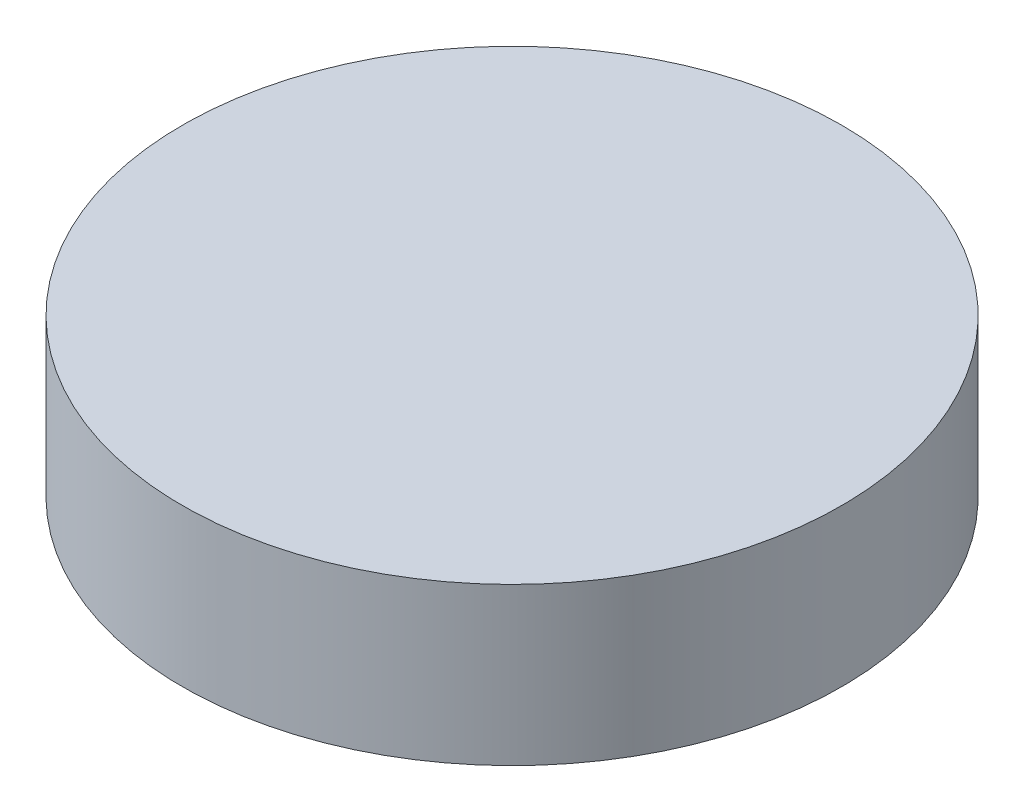
ISO-10303-21;
HEADER;
FILE_DESCRIPTION(('STEP AP214'),'2;1');
FILE_NAME('part.step','',(''),(''),'','','');
FILE_SCHEMA(('AUTOMOTIVE_DESIGN { 1 0 10303 214 1 1 1 1 }'));
ENDSEC;
DATA;
#1=APPLICATION_CONTEXT('core data for automotive mechanical design processes');
#2=APPLICATION_PROTOCOL_DEFINITION('international standard','automotive_design',2000,#1);
#3=PRODUCT_CONTEXT('',#1,'mechanical');
#4=PRODUCT('Part','Part','',(#3));
#5=PRODUCT_RELATED_PRODUCT_CATEGORY('part','',(#4));
#6=PRODUCT_DEFINITION_FORMATION('','',#4);
#7=PRODUCT_DEFINITION_CONTEXT('part definition',#1,'design');
#8=PRODUCT_DEFINITION('design','',#6,#7);
#9=PRODUCT_DEFINITION_SHAPE('','',#8);
#10=(LENGTH_UNIT() NAMED_UNIT(*) SI_UNIT(.MILLI.,.METRE.));
#11=(NAMED_UNIT(*) PLANE_ANGLE_UNIT() SI_UNIT($,.RADIAN.));
#12=(NAMED_UNIT(*) SI_UNIT($,.STERADIAN.) SOLID_ANGLE_UNIT());
#13=UNCERTAINTY_MEASURE_WITH_UNIT(LENGTH_MEASURE(1.E-05),#10,'distance_accuracy_value','');
#14=(GEOMETRIC_REPRESENTATION_CONTEXT(3) GLOBAL_UNCERTAINTY_ASSIGNED_CONTEXT((#13)) GLOBAL_UNIT_ASSIGNED_CONTEXT((#10,
#11,#12)) REPRESENTATION_CONTEXT('',''));
#15=CARTESIAN_POINT('',(0.,0.,0.));
#16=DIRECTION('',(0.,0.,1.));
#17=DIRECTION('',(1.,0.,0.));
#18=AXIS2_PLACEMENT_3D('',#15,#16,#17);
#19=CARTESIAN_POINT('',(0.,0.,0.));
#20=DIRECTION('',(0.,-1.,0.));
#21=DIRECTION('',(0.,0.,-1.));
#22=AXIS2_PLACEMENT_3D('',#19,#20,#21);
#23=PLANE('',#22);
#24=CARTESIAN_POINT('',(0.,0.,0.));
#25=DIRECTION('',(0.,-1.,0.));
#26=DIRECTION('',(0.,0.,-1.));
#27=AXIS2_PLACEMENT_3D('',#24,#25,#26);
#28=CIRCLE('',#27,10.5);
#29=CARTESIAN_POINT('',(0.,0.,-10.5));
#30=VERTEX_POINT('',#29);
#31=EDGE_CURVE('E10',#30,#30,#28,.T.);
#32=ORIENTED_EDGE('',*,*,#31,.T.);
#33=EDGE_LOOP('',(#32));
#34=FACE_BOUND('',#33,.T.);
#35=ADVANCED_FACE('F37',(#34),#23,.T.);
#36=CARTESIAN_POINT('',(0.,0.,0.));
#37=DIRECTION('',(0.,-1.,0.));
#38=DIRECTION('',(0.,0.,-1.));
#39=AXIS2_PLACEMENT_3D('',#36,#37,#38);
#40=CYLINDRICAL_SURFACE('',#39,10.5);
#41=CARTESIAN_POINT('',(0.,5.,0.));
#42=DIRECTION('',(0.,-1.,0.));
#43=DIRECTION('',(0.,0.,-1.));
#44=AXIS2_PLACEMENT_3D('',#41,#42,#43);
#45=CIRCLE('',#44,10.5);
#46=CARTESIAN_POINT('',(0.,5.,-10.5));
#47=VERTEX_POINT('',#46);
#48=EDGE_CURVE('E43',#47,#47,#45,.T.);
#49=ORIENTED_EDGE('',*,*,#48,.T.);
#50=EDGE_LOOP('',(#49));
#51=FACE_BOUND('',#50,.T.);
#52=ORIENTED_EDGE('',*,*,#31,.F.);
#53=EDGE_LOOP('',(#52));
#54=FACE_BOUND('',#53,.T.);
#55=ADVANCED_FACE('F49',(#51,#54),#40,.T.);
#56=CARTESIAN_POINT('',(10.5,5.,0.));
#57=DIRECTION('',(0.,1.,0.));
#58=DIRECTION('',(0.,0.,1.));
#59=AXIS2_PLACEMENT_3D('',#56,#57,#58);
#60=PLANE('',#59);
#61=ORIENTED_EDGE('',*,*,#48,.F.);
#62=EDGE_LOOP('',(#61));
#63=FACE_BOUND('',#62,.T.);
#64=ADVANCED_FACE('F52',(#63),#60,.T.);
#65=CLOSED_SHELL('',(#35,#55,#64));
#66=MANIFOLD_SOLID_BREP('B2',#65);
#67=ADVANCED_BREP_SHAPE_REPRESENTATION('',(#18,#66),#14);
#68=SHAPE_DEFINITION_REPRESENTATION(#9,#67);
ENDSEC;
END-ISO-10303-21;
